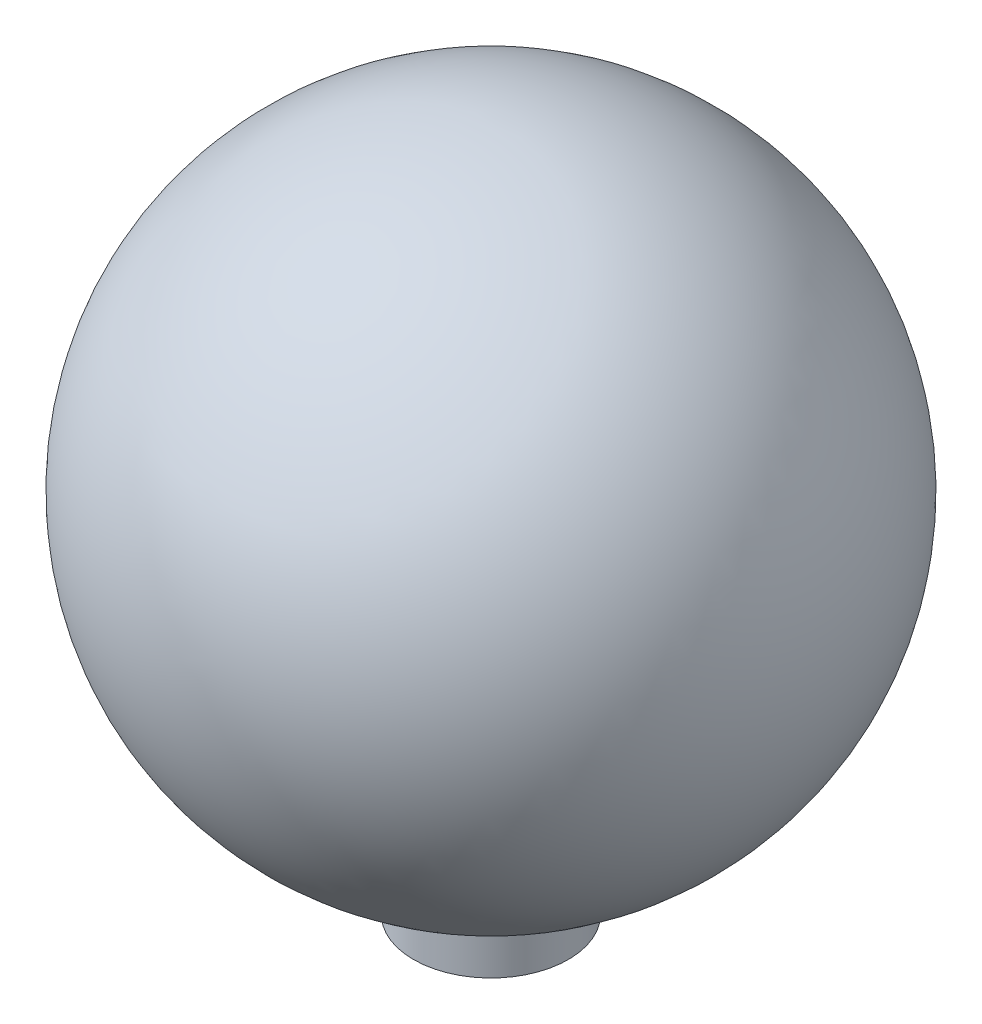
ISO-10303-21;
HEADER;
FILE_DESCRIPTION(('STEP AP214'),'2;1');
FILE_NAME('part.step','',(''),(''),'','','');
FILE_SCHEMA(('AUTOMOTIVE_DESIGN { 1 0 10303 214 1 1 1 1 }'));
ENDSEC;
DATA;
#1=APPLICATION_CONTEXT('core data for automotive mechanical design processes');
#2=APPLICATION_PROTOCOL_DEFINITION('international standard','automotive_design',2000,#1);
#3=PRODUCT_CONTEXT('',#1,'mechanical');
#4=PRODUCT('Part','Part','',(#3));
#5=PRODUCT_RELATED_PRODUCT_CATEGORY('part','',(#4));
#6=PRODUCT_DEFINITION_FORMATION('','',#4);
#7=PRODUCT_DEFINITION_CONTEXT('part definition',#1,'design');
#8=PRODUCT_DEFINITION('design','',#6,#7);
#9=PRODUCT_DEFINITION_SHAPE('','',#8);
#10=(LENGTH_UNIT() NAMED_UNIT(*) SI_UNIT(.MILLI.,.METRE.));
#11=(NAMED_UNIT(*) PLANE_ANGLE_UNIT() SI_UNIT($,.RADIAN.));
#12=(NAMED_UNIT(*) SI_UNIT($,.STERADIAN.) SOLID_ANGLE_UNIT());
#13=UNCERTAINTY_MEASURE_WITH_UNIT(LENGTH_MEASURE(1.E-05),#10,'distance_accuracy_value','');
#14=(GEOMETRIC_REPRESENTATION_CONTEXT(3) GLOBAL_UNCERTAINTY_ASSIGNED_CONTEXT((#13)) GLOBAL_UNIT_ASSIGNED_CONTEXT((#10,
#11,#12)) REPRESENTATION_CONTEXT('',''));
#15=CARTESIAN_POINT('',(0.,0.,0.));
#16=DIRECTION('',(0.,0.,1.));
#17=DIRECTION('',(1.,0.,0.));
#18=AXIS2_PLACEMENT_3D('',#15,#16,#17);
#19=CARTESIAN_POINT('',(0.,2.54,0.));
#20=DIRECTION('',(0.,-1.,0.));
#21=DIRECTION('',(0.,0.,-1.));
#22=AXIS2_PLACEMENT_3D('',#19,#20,#21);
#23=CYLINDRICAL_SURFACE('',#22,3.175);
#24=CARTESIAN_POINT('',(0.,2.54,0.));
#25=DIRECTION('',(0.,1.,0.));
#26=DIRECTION('',(0.,0.,1.));
#27=AXIS2_PLACEMENT_3D('',#24,#25,#26);
#28=CIRCLE('',#27,3.175);
#29=CARTESIAN_POINT('',(0.,2.54,3.175));
#30=VERTEX_POINT('',#29);
#31=EDGE_CURVE('E11',#30,#30,#28,.T.);
#32=ORIENTED_EDGE('',*,*,#31,.F.);
#33=EDGE_LOOP('',(#32));
#34=FACE_BOUND('',#33,.T.);
#35=CARTESIAN_POINT('',(0.,0.,0.));
#36=DIRECTION('',(0.,1.,0.));
#37=DIRECTION('',(0.,0.,1.));
#38=AXIS2_PLACEMENT_3D('',#35,#36,#37);
#39=CIRCLE('',#38,3.175);
#40=CARTESIAN_POINT('',(0.,0.,3.175));
#41=VERTEX_POINT('',#40);
#42=EDGE_CURVE('E41',#41,#41,#39,.T.);
#43=ORIENTED_EDGE('',*,*,#42,.T.);
#44=EDGE_LOOP('',(#43));
#45=FACE_BOUND('',#44,.T.);
#46=ADVANCED_FACE('F34',(#34,#45),#23,.T.);
#47=CARTESIAN_POINT('',(0.,15.0415625,0.));
#48=DIRECTION('',(0.,0.,1.));
#49=DIRECTION('',(1.,0.,0.));
#50=AXIS2_PLACEMENT_3D('',#47,#48,#49);
#51=SPHERICAL_SURFACE('',#50,12.8984375);
#52=CARTESIAN_POINT('',(0.,15.0415625,0.));
#53=DIRECTION('',(0.,1.,0.));
#54=DIRECTION('',(0.,0.,1.));
#55=AXIS2_PLACEMENT_3D('',#52,#53,#54);
#56=SPHERICAL_SURFACE('',#55,12.8984375);
#57=ORIENTED_EDGE('',*,*,#31,.T.);
#58=EDGE_LOOP('',(#57));
#59=FACE_BOUND('',#58,.T.);
#60=ADVANCED_FACE('F36',(#59),#56,.T.);
#61=CARTESIAN_POINT('',(0.,0.,0.));
#62=DIRECTION('',(0.,1.,0.));
#63=DIRECTION('',(0.,0.,1.));
#64=AXIS2_PLACEMENT_3D('',#61,#62,#63);
#65=PLANE('',#64);
#66=CARTESIAN_POINT('',(0.,0.,0.));
#67=DIRECTION('',(0.,-1.,0.));
#68=DIRECTION('',(0.,0.,-1.));
#69=AXIS2_PLACEMENT_3D('',#66,#67,#68);
#70=CIRCLE('',#69,2.6543);
#71=CARTESIAN_POINT('',(0.,0.,-2.6543));
#72=VERTEX_POINT('',#71);
#73=EDGE_CURVE('E54',#72,#72,#70,.T.);
#74=ORIENTED_EDGE('',*,*,#73,.F.);
#75=EDGE_LOOP('',(#74));
#76=FACE_BOUND('',#75,.T.);
#77=ORIENTED_EDGE('',*,*,#42,.F.);
#78=EDGE_LOOP('',(#77));
#79=FACE_BOUND('',#78,.T.);
#80=ADVANCED_FACE('F48',(#76,#79),#65,.F.);
#81=CARTESIAN_POINT('',(0.,6.35,0.));
#82=DIRECTION('',(0.,-1.,0.));
#83=DIRECTION('',(0.,0.,-1.));
#84=AXIS2_PLACEMENT_3D('',#81,#82,#83);
#85=CONICAL_SURFACE('',#84,2.6543,1.02974425867665);
#86=CARTESIAN_POINT('',(0.,7.94486434108485,0.));
#87=VERTEX_POINT('',#86);
#88=VERTEX_LOOP('',#87);
#89=FACE_BOUND('',#88,.T.);
#90=CARTESIAN_POINT('',(0.,6.35,0.));
#91=DIRECTION('',(0.,-1.,0.));
#92=DIRECTION('',(0.,0.,-1.));
#93=AXIS2_PLACEMENT_3D('',#90,#91,#92);
#94=CIRCLE('',#93,2.6543);
#95=CARTESIAN_POINT('',(0.,6.35,-2.6543));
#96=VERTEX_POINT('',#95);
#97=EDGE_CURVE('E52',#96,#96,#94,.T.);
#98=ORIENTED_EDGE('',*,*,#97,.T.);
#99=EDGE_LOOP('',(#98));
#100=FACE_BOUND('',#99,.T.);
#101=ADVANCED_FACE('F44',(#89,#100),#85,.F.);
#102=CARTESIAN_POINT('',(0.,0.,0.));
#103=DIRECTION('',(0.,-1.,0.));
#104=DIRECTION('',(0.,0.,-1.));
#105=AXIS2_PLACEMENT_3D('',#102,#103,#104);
#106=CYLINDRICAL_SURFACE('',#105,2.6543);
#107=ORIENTED_EDGE('',*,*,#97,.F.);
#108=EDGE_LOOP('',(#107));
#109=FACE_BOUND('',#108,.T.);
#110=ORIENTED_EDGE('',*,*,#73,.T.);
#111=EDGE_LOOP('',(#110));
#112=FACE_BOUND('',#111,.T.);
#113=ADVANCED_FACE('F47',(#109,#112),#106,.F.);
#114=CLOSED_SHELL('',(#46,#60,#80,#101,#113));
#115=MANIFOLD_SOLID_BREP('B2',#114);
#116=ADVANCED_BREP_SHAPE_REPRESENTATION('',(#18,#115),#14);
#117=SHAPE_DEFINITION_REPRESENTATION(#9,#116);
ENDSEC;
END-ISO-10303-21;
